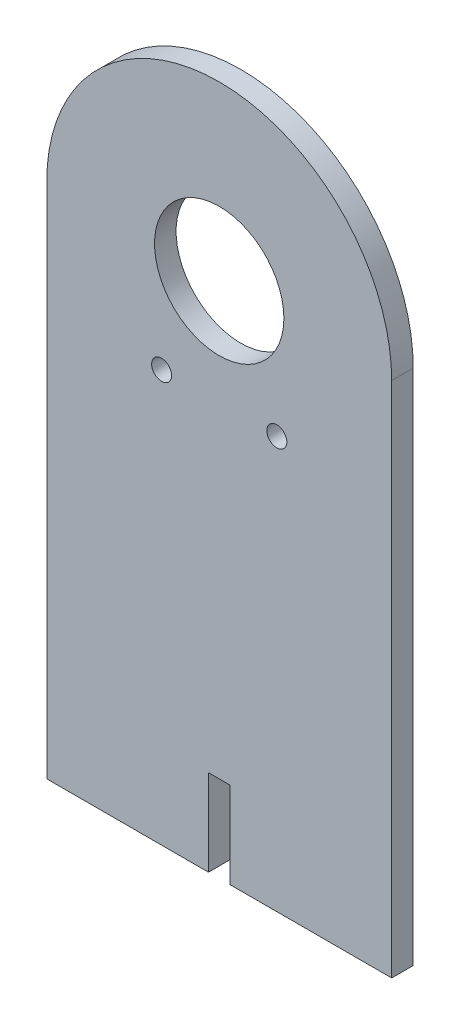
ISO-10303-21;
HEADER;
FILE_DESCRIPTION(('STEP AP214'),'2;1');
FILE_NAME('part.step','',(''),(''),'','','');
FILE_SCHEMA(('AUTOMOTIVE_DESIGN { 1 0 10303 214 1 1 1 1 }'));
ENDSEC;
DATA;
#1=APPLICATION_CONTEXT('core data for automotive mechanical design processes');
#2=APPLICATION_PROTOCOL_DEFINITION('international standard','automotive_design',2000,#1);
#3=PRODUCT_CONTEXT('',#1,'mechanical');
#4=PRODUCT('Part','Part','',(#3));
#5=PRODUCT_RELATED_PRODUCT_CATEGORY('part','',(#4));
#6=PRODUCT_DEFINITION_FORMATION('','',#4);
#7=PRODUCT_DEFINITION_CONTEXT('part definition',#1,'design');
#8=PRODUCT_DEFINITION('design','',#6,#7);
#9=PRODUCT_DEFINITION_SHAPE('','',#8);
#10=(LENGTH_UNIT() NAMED_UNIT(*) SI_UNIT(.MILLI.,.METRE.));
#11=(NAMED_UNIT(*) PLANE_ANGLE_UNIT() SI_UNIT($,.RADIAN.));
#12=(NAMED_UNIT(*) SI_UNIT($,.STERADIAN.) SOLID_ANGLE_UNIT());
#13=UNCERTAINTY_MEASURE_WITH_UNIT(LENGTH_MEASURE(1.E-05),#10,'distance_accuracy_value','');
#14=(GEOMETRIC_REPRESENTATION_CONTEXT(3) GLOBAL_UNCERTAINTY_ASSIGNED_CONTEXT((#13)) GLOBAL_UNIT_ASSIGNED_CONTEXT((#10,
#11,#12)) REPRESENTATION_CONTEXT('',''));
#15=CARTESIAN_POINT('',(0.,0.,0.));
#16=DIRECTION('',(0.,0.,1.));
#17=DIRECTION('',(1.,0.,0.));
#18=AXIS2_PLACEMENT_3D('',#15,#16,#17);
#19=CARTESIAN_POINT('',(0.,0.,3.175));
#20=DIRECTION('',(0.,1.,0.));
#21=DIRECTION('',(0.,0.,1.));
#22=AXIS2_PLACEMENT_3D('',#19,#20,#21);
#23=PLANE('',#22);
#24=DIRECTION('',(1.,0.,0.));
#25=VECTOR('',#24,1.);
#26=CARTESIAN_POINT('',(0.,0.,0.));
#27=LINE('',#26,#25);
#28=CARTESIAN_POINT('',(0.,0.,0.));
#29=VERTEX_POINT('',#28);
#30=CARTESIAN_POINT('',(23.8125,0.,0.));
#31=VERTEX_POINT('',#30);
#32=EDGE_CURVE('E127',#29,#31,#27,.T.);
#33=ORIENTED_EDGE('',*,*,#32,.T.);
#34=DIRECTION('',(0.,0.,1.));
#35=VECTOR('',#34,1.);
#36=CARTESIAN_POINT('',(23.8125,0.,-3.175));
#37=LINE('',#36,#35);
#38=CARTESIAN_POINT('',(23.8125,0.,3.175));
#39=VERTEX_POINT('',#38);
#40=EDGE_CURVE('E117',#31,#39,#37,.T.);
#41=ORIENTED_EDGE('',*,*,#40,.T.);
#42=DIRECTION('',(1.,0.,0.));
#43=VECTOR('',#42,1.);
#44=CARTESIAN_POINT('',(0.,0.,3.175));
#45=LINE('',#44,#43);
#46=CARTESIAN_POINT('',(0.,0.,3.175));
#47=VERTEX_POINT('',#46);
#48=EDGE_CURVE('E93',#47,#39,#45,.T.);
#49=ORIENTED_EDGE('',*,*,#48,.F.);
#50=DIRECTION('',(0.,0.,-1.));
#51=VECTOR('',#50,1.);
#52=CARTESIAN_POINT('',(0.,0.,3.175));
#53=LINE('',#52,#51);
#54=EDGE_CURVE('E169',#47,#29,#53,.T.);
#55=ORIENTED_EDGE('',*,*,#54,.T.);
#56=EDGE_LOOP('',(#33,#41,#49,#55));
#57=FACE_BOUND('',#56,.T.);
#58=ADVANCED_FACE('F39',(#57),#23,.F.);
#59=CARTESIAN_POINT('',(0.,0.,3.175));
#60=DIRECTION('',(1.,0.,0.));
#61=DIRECTION('',(0.,0.,-1.));
#62=AXIS2_PLACEMENT_3D('',#59,#60,#61);
#63=PLANE('',#62);
#64=DIRECTION('',(0.,-1.,0.));
#65=VECTOR('',#64,1.);
#66=CARTESIAN_POINT('',(0.,0.,0.));
#67=LINE('',#66,#65);
#68=CARTESIAN_POINT('',(0.,76.2,0.));
#69=VERTEX_POINT('',#68);
#70=EDGE_CURVE('E148',#69,#29,#67,.T.);
#71=ORIENTED_EDGE('',*,*,#70,.T.);
#72=ORIENTED_EDGE('',*,*,#54,.F.);
#73=DIRECTION('',(0.,-1.,0.));
#74=VECTOR('',#73,1.);
#75=CARTESIAN_POINT('',(0.,0.,3.175));
#76=LINE('',#75,#74);
#77=CARTESIAN_POINT('',(0.,76.2,3.175));
#78=VERTEX_POINT('',#77);
#79=EDGE_CURVE('E134',#78,#47,#76,.T.);
#80=ORIENTED_EDGE('',*,*,#79,.F.);
#81=DIRECTION('',(0.,0.,-1.));
#82=VECTOR('',#81,1.);
#83=CARTESIAN_POINT('',(0.,76.2,3.175));
#84=LINE('',#83,#82);
#85=EDGE_CURVE('E147',#78,#69,#84,.T.);
#86=ORIENTED_EDGE('',*,*,#85,.T.);
#87=EDGE_LOOP('',(#71,#72,#80,#86));
#88=FACE_BOUND('',#87,.T.);
#89=ADVANCED_FACE('F41',(#88),#63,.F.);
#90=CARTESIAN_POINT('',(26.9875,0.,3.175));
#91=VERTEX_POINT('',#90);
#92=CARTESIAN_POINT('',(50.8,0.,3.175));
#93=VERTEX_POINT('',#92);
#94=EDGE_CURVE('E138',#91,#93,#45,.T.);
#95=ORIENTED_EDGE('',*,*,#94,.F.);
#96=DIRECTION('',(0.,0.,1.));
#97=VECTOR('',#96,1.);
#98=CARTESIAN_POINT('',(26.9875,0.,-3.175));
#99=LINE('',#98,#97);
#100=CARTESIAN_POINT('',(26.9875,0.,0.));
#101=VERTEX_POINT('',#100);
#102=EDGE_CURVE('E129',#101,#91,#99,.T.);
#103=ORIENTED_EDGE('',*,*,#102,.F.);
#104=CARTESIAN_POINT('',(50.8,0.,0.));
#105=VERTEX_POINT('',#104);
#106=EDGE_CURVE('E152',#101,#105,#27,.T.);
#107=ORIENTED_EDGE('',*,*,#106,.T.);
#108=DIRECTION('',(0.,0.,-1.));
#109=VECTOR('',#108,1.);
#110=CARTESIAN_POINT('',(50.8,0.,3.175));
#111=LINE('',#110,#109);
#112=EDGE_CURVE('E165',#93,#105,#111,.T.);
#113=ORIENTED_EDGE('',*,*,#112,.F.);
#114=EDGE_LOOP('',(#95,#103,#107,#113));
#115=FACE_BOUND('',#114,.T.);
#116=ADVANCED_FACE('F197',(#115),#23,.F.);
#117=CARTESIAN_POINT('',(50.8,0.,3.175));
#118=DIRECTION('',(-1.,0.,0.));
#119=DIRECTION('',(0.,0.,1.));
#120=AXIS2_PLACEMENT_3D('',#117,#118,#119);
#121=PLANE('',#120);
#122=DIRECTION('',(0.,1.,0.));
#123=VECTOR('',#122,1.);
#124=CARTESIAN_POINT('',(50.8,0.,0.));
#125=LINE('',#124,#123);
#126=CARTESIAN_POINT('',(50.8,76.2,0.));
#127=VERTEX_POINT('',#126);
#128=EDGE_CURVE('E155',#105,#127,#125,.T.);
#129=ORIENTED_EDGE('',*,*,#128,.T.);
#130=DIRECTION('',(0.,0.,-1.));
#131=VECTOR('',#130,1.);
#132=CARTESIAN_POINT('',(50.8,76.2,3.175));
#133=LINE('',#132,#131);
#134=CARTESIAN_POINT('',(50.8,76.2,3.175));
#135=VERTEX_POINT('',#134);
#136=EDGE_CURVE('E162',#135,#127,#133,.T.);
#137=ORIENTED_EDGE('',*,*,#136,.F.);
#138=DIRECTION('',(0.,1.,0.));
#139=VECTOR('',#138,1.);
#140=CARTESIAN_POINT('',(50.8,0.,3.175));
#141=LINE('',#140,#139);
#142=EDGE_CURVE('E137',#93,#135,#141,.T.);
#143=ORIENTED_EDGE('',*,*,#142,.F.);
#144=ORIENTED_EDGE('',*,*,#112,.T.);
#145=EDGE_LOOP('',(#129,#137,#143,#144));
#146=FACE_BOUND('',#145,.T.);
#147=ADVANCED_FACE('F202',(#146),#121,.F.);
#148=CARTESIAN_POINT('',(25.4,76.2,3.175));
#149=DIRECTION('',(0.,0.,-1.));
#150=DIRECTION('',(-1.,0.,0.));
#151=AXIS2_PLACEMENT_3D('',#148,#149,#150);
#152=CYLINDRICAL_SURFACE('',#151,25.4);
#153=CARTESIAN_POINT('',(25.4,76.2,0.));
#154=DIRECTION('',(0.,0.,1.));
#155=DIRECTION('',(1.,0.,0.));
#156=AXIS2_PLACEMENT_3D('',#153,#154,#155);
#157=CIRCLE('',#156,25.4);
#158=EDGE_CURVE('E85',#127,#69,#157,.T.);
#159=ORIENTED_EDGE('',*,*,#158,.T.);
#160=ORIENTED_EDGE('',*,*,#85,.F.);
#161=CARTESIAN_POINT('',(25.4,76.2,3.175));
#162=DIRECTION('',(0.,0.,1.));
#163=DIRECTION('',(1.,0.,0.));
#164=AXIS2_PLACEMENT_3D('',#161,#162,#163);
#165=CIRCLE('',#164,25.4);
#166=EDGE_CURVE('E64',#135,#78,#165,.T.);
#167=ORIENTED_EDGE('',*,*,#166,.F.);
#168=ORIENTED_EDGE('',*,*,#136,.T.);
#169=EDGE_LOOP('',(#159,#160,#167,#168));
#170=FACE_BOUND('',#169,.T.);
#171=ADVANCED_FACE('F203',(#170),#152,.T.);
#172=CARTESIAN_POINT('',(25.4,76.2,3.175));
#173=DIRECTION('',(0.,0.,1.));
#174=DIRECTION('',(1.,0.,0.));
#175=AXIS2_PLACEMENT_3D('',#172,#173,#174);
#176=PLANE('',#175);
#177=CARTESIAN_POINT('',(16.9164,60.6298,3.175));
#178=DIRECTION('',(0.,0.,1.));
#179=DIRECTION('',(1.,0.,0.));
#180=AXIS2_PLACEMENT_3D('',#177,#178,#179);
#181=CIRCLE('',#180,1.47319999999999);
#182=CARTESIAN_POINT('',(18.3896,60.6298,3.175));
#183=VERTEX_POINT('',#182);
#184=EDGE_CURVE('E251',#183,#183,#181,.T.);
#185=ORIENTED_EDGE('',*,*,#184,.F.);
#186=EDGE_LOOP('',(#185));
#187=FACE_BOUND('',#186,.T.);
#188=CARTESIAN_POINT('',(33.8836,60.6298,3.175));
#189=DIRECTION('',(0.,0.,1.));
#190=DIRECTION('',(1.,0.,0.));
#191=AXIS2_PLACEMENT_3D('',#188,#189,#190);
#192=CIRCLE('',#191,1.47319999999999);
#193=CARTESIAN_POINT('',(35.3568,60.6298,3.175));
#194=VERTEX_POINT('',#193);
#195=EDGE_CURVE('E255',#194,#194,#192,.T.);
#196=ORIENTED_EDGE('',*,*,#195,.F.);
#197=EDGE_LOOP('',(#196));
#198=FACE_BOUND('',#197,.T.);
#199=CARTESIAN_POINT('',(25.4,76.2,3.175));
#200=DIRECTION('',(0.,0.,1.));
#201=DIRECTION('',(1.,0.,0.));
#202=AXIS2_PLACEMENT_3D('',#199,#200,#201);
#203=CIRCLE('',#202,9.525);
#204=CARTESIAN_POINT('',(34.925,76.2,3.175));
#205=VERTEX_POINT('',#204);
#206=EDGE_CURVE('E265',#205,#205,#203,.T.);
#207=ORIENTED_EDGE('',*,*,#206,.F.);
#208=EDGE_LOOP('',(#207));
#209=FACE_BOUND('',#208,.T.);
#210=DIRECTION('',(0.,-1.,0.));
#211=VECTOR('',#210,1.);
#212=CARTESIAN_POINT('',(23.8125,0.,3.175));
#213=LINE('',#212,#211);
#214=CARTESIAN_POINT('',(23.8125,12.7,3.175));
#215=VERTEX_POINT('',#214);
#216=EDGE_CURVE('E115',#215,#39,#213,.T.);
#217=ORIENTED_EDGE('',*,*,#216,.F.);
#218=DIRECTION('',(-1.,0.,0.));
#219=VECTOR('',#218,1.);
#220=CARTESIAN_POINT('',(23.8125,12.7,3.175));
#221=LINE('',#220,#219);
#222=CARTESIAN_POINT('',(26.9875,12.7,3.175));
#223=VERTEX_POINT('',#222);
#224=EDGE_CURVE('E130',#223,#215,#221,.T.);
#225=ORIENTED_EDGE('',*,*,#224,.F.);
#226=DIRECTION('',(0.,1.,0.));
#227=VECTOR('',#226,1.);
#228=CARTESIAN_POINT('',(26.9875,0.,3.175));
#229=LINE('',#228,#227);
#230=EDGE_CURVE('E123',#91,#223,#229,.T.);
#231=ORIENTED_EDGE('',*,*,#230,.F.);
#232=ORIENTED_EDGE('',*,*,#94,.T.);
#233=ORIENTED_EDGE('',*,*,#142,.T.);
#234=ORIENTED_EDGE('',*,*,#166,.T.);
#235=ORIENTED_EDGE('',*,*,#79,.T.);
#236=ORIENTED_EDGE('',*,*,#48,.T.);
#237=EDGE_LOOP('',(#217,#225,#231,#232,#233,#234,#235,#236));
#238=FACE_BOUND('',#237,.T.);
#239=ADVANCED_FACE('F132',(#187,#198,#209,#238),#176,.T.);
#240=CARTESIAN_POINT('',(25.4,76.2,0.));
#241=DIRECTION('',(0.,0.,1.));
#242=DIRECTION('',(1.,0.,0.));
#243=AXIS2_PLACEMENT_3D('',#240,#241,#242);
#244=PLANE('',#243);
#245=CARTESIAN_POINT('',(16.9164,60.6298,0.));
#246=DIRECTION('',(0.,0.,1.));
#247=DIRECTION('',(1.,0.,0.));
#248=AXIS2_PLACEMENT_3D('',#245,#246,#247);
#249=CIRCLE('',#248,1.4732);
#250=CARTESIAN_POINT('',(18.3896,60.6298,0.));
#251=VERTEX_POINT('',#250);
#252=EDGE_CURVE('E248',#251,#251,#249,.T.);
#253=ORIENTED_EDGE('',*,*,#252,.T.);
#254=EDGE_LOOP('',(#253));
#255=FACE_BOUND('',#254,.T.);
#256=CARTESIAN_POINT('',(33.8836,60.6298,0.));
#257=DIRECTION('',(0.,0.,1.));
#258=DIRECTION('',(1.,0.,0.));
#259=AXIS2_PLACEMENT_3D('',#256,#257,#258);
#260=CIRCLE('',#259,1.4732);
#261=CARTESIAN_POINT('',(35.3568,60.6298,0.));
#262=VERTEX_POINT('',#261);
#263=EDGE_CURVE('E261',#262,#262,#260,.T.);
#264=ORIENTED_EDGE('',*,*,#263,.T.);
#265=EDGE_LOOP('',(#264));
#266=FACE_BOUND('',#265,.T.);
#267=CARTESIAN_POINT('',(25.4,76.2,0.));
#268=DIRECTION('',(0.,0.,1.));
#269=DIRECTION('',(1.,0.,0.));
#270=AXIS2_PLACEMENT_3D('',#267,#268,#269);
#271=CIRCLE('',#270,9.525);
#272=CARTESIAN_POINT('',(34.925,76.2,0.));
#273=VERTEX_POINT('',#272);
#274=EDGE_CURVE('E124',#273,#273,#271,.T.);
#275=ORIENTED_EDGE('',*,*,#274,.T.);
#276=EDGE_LOOP('',(#275));
#277=FACE_BOUND('',#276,.T.);
#278=DIRECTION('',(-1.,0.,0.));
#279=VECTOR('',#278,1.);
#280=CARTESIAN_POINT('',(25.4,12.7,0.));
#281=LINE('',#280,#279);
#282=CARTESIAN_POINT('',(26.9875,12.7,0.));
#283=VERTEX_POINT('',#282);
#284=CARTESIAN_POINT('',(23.8125,12.7,0.));
#285=VERTEX_POINT('',#284);
#286=EDGE_CURVE('E48',#283,#285,#281,.T.);
#287=ORIENTED_EDGE('',*,*,#286,.T.);
#288=DIRECTION('',(0.,-1.,0.));
#289=VECTOR('',#288,1.);
#290=CARTESIAN_POINT('',(23.8125,76.2,0.));
#291=LINE('',#290,#289);
#292=EDGE_CURVE('E11',#285,#31,#291,.T.);
#293=ORIENTED_EDGE('',*,*,#292,.T.);
#294=ORIENTED_EDGE('',*,*,#32,.F.);
#295=ORIENTED_EDGE('',*,*,#70,.F.);
#296=ORIENTED_EDGE('',*,*,#158,.F.);
#297=ORIENTED_EDGE('',*,*,#128,.F.);
#298=ORIENTED_EDGE('',*,*,#106,.F.);
#299=DIRECTION('',(0.,1.,0.));
#300=VECTOR('',#299,1.);
#301=CARTESIAN_POINT('',(26.9875,76.2,0.));
#302=LINE('',#301,#300);
#303=EDGE_CURVE('E172',#101,#283,#302,.T.);
#304=ORIENTED_EDGE('',*,*,#303,.T.);
#305=EDGE_LOOP('',(#287,#293,#294,#295,#296,#297,#298,#304));
#306=FACE_BOUND('',#305,.T.);
#307=ADVANCED_FACE('F178',(#255,#266,#277,#306),#244,.F.);
#308=CARTESIAN_POINT('',(23.8125,0.,-3.175));
#309=DIRECTION('',(-1.,0.,0.));
#310=DIRECTION('',(0.,0.,1.));
#311=AXIS2_PLACEMENT_3D('',#308,#309,#310);
#312=PLANE('',#311);
#313=DIRECTION('',(0.,0.,1.));
#314=VECTOR('',#313,1.);
#315=CARTESIAN_POINT('',(23.8125,12.7,-3.175));
#316=LINE('',#315,#314);
#317=EDGE_CURVE('E119',#285,#215,#316,.T.);
#318=ORIENTED_EDGE('',*,*,#317,.T.);
#319=ORIENTED_EDGE('',*,*,#216,.T.);
#320=ORIENTED_EDGE('',*,*,#40,.F.);
#321=ORIENTED_EDGE('',*,*,#292,.F.);
#322=EDGE_LOOP('',(#318,#319,#320,#321));
#323=FACE_BOUND('',#322,.T.);
#324=ADVANCED_FACE('F116',(#323),#312,.F.);
#325=CARTESIAN_POINT('',(23.8125,12.7,-3.175));
#326=DIRECTION('',(0.,1.,0.));
#327=DIRECTION('',(0.,0.,1.));
#328=AXIS2_PLACEMENT_3D('',#325,#326,#327);
#329=PLANE('',#328);
#330=DIRECTION('',(0.,0.,1.));
#331=VECTOR('',#330,1.);
#332=CARTESIAN_POINT('',(26.9875,12.7,-3.175));
#333=LINE('',#332,#331);
#334=EDGE_CURVE('E55',#283,#223,#333,.T.);
#335=ORIENTED_EDGE('',*,*,#334,.T.);
#336=ORIENTED_EDGE('',*,*,#224,.T.);
#337=ORIENTED_EDGE('',*,*,#317,.F.);
#338=ORIENTED_EDGE('',*,*,#286,.F.);
#339=EDGE_LOOP('',(#335,#336,#337,#338));
#340=FACE_BOUND('',#339,.T.);
#341=ADVANCED_FACE('F181',(#340),#329,.F.);
#342=CARTESIAN_POINT('',(26.9875,0.,-3.175));
#343=DIRECTION('',(1.,0.,0.));
#344=DIRECTION('',(0.,1.,0.));
#345=AXIS2_PLACEMENT_3D('',#342,#343,#344);
#346=PLANE('',#345);
#347=ORIENTED_EDGE('',*,*,#102,.T.);
#348=ORIENTED_EDGE('',*,*,#230,.T.);
#349=ORIENTED_EDGE('',*,*,#334,.F.);
#350=ORIENTED_EDGE('',*,*,#303,.F.);
#351=EDGE_LOOP('',(#347,#348,#349,#350));
#352=FACE_BOUND('',#351,.T.);
#353=ADVANCED_FACE('F192',(#352),#346,.F.);
#354=CARTESIAN_POINT('',(25.4,76.2,3.175));
#355=DIRECTION('',(0.,0.,1.));
#356=DIRECTION('',(1.,0.,0.));
#357=AXIS2_PLACEMENT_3D('',#354,#355,#356);
#358=CYLINDRICAL_SURFACE('',#357,9.525);
#359=ORIENTED_EDGE('',*,*,#274,.F.);
#360=EDGE_LOOP('',(#359));
#361=FACE_BOUND('',#360,.T.);
#362=ORIENTED_EDGE('',*,*,#206,.T.);
#363=EDGE_LOOP('',(#362));
#364=FACE_BOUND('',#363,.T.);
#365=ADVANCED_FACE('F230',(#361,#364),#358,.F.);
#366=CARTESIAN_POINT('',(33.8836,60.6298,3.175));
#367=DIRECTION('',(0.,0.,1.));
#368=DIRECTION('',(1.,0.,0.));
#369=AXIS2_PLACEMENT_3D('',#366,#367,#368);
#370=CYLINDRICAL_SURFACE('',#369,1.4732);
#371=ORIENTED_EDGE('',*,*,#263,.F.);
#372=EDGE_LOOP('',(#371));
#373=FACE_BOUND('',#372,.T.);
#374=ORIENTED_EDGE('',*,*,#195,.T.);
#375=EDGE_LOOP('',(#374));
#376=FACE_BOUND('',#375,.T.);
#377=ADVANCED_FACE('F235',(#373,#376),#370,.F.);
#378=CARTESIAN_POINT('',(16.9164,60.6298,3.175));
#379=DIRECTION('',(0.,0.,1.));
#380=DIRECTION('',(1.,0.,0.));
#381=AXIS2_PLACEMENT_3D('',#378,#379,#380);
#382=CYLINDRICAL_SURFACE('',#381,1.4732);
#383=ORIENTED_EDGE('',*,*,#252,.F.);
#384=EDGE_LOOP('',(#383));
#385=FACE_BOUND('',#384,.T.);
#386=ORIENTED_EDGE('',*,*,#184,.T.);
#387=EDGE_LOOP('',(#386));
#388=FACE_BOUND('',#387,.T.);
#389=ADVANCED_FACE('F239',(#385,#388),#382,.F.);
#390=CLOSED_SHELL('',(#58,#89,#116,#147,#171,#239,#307,#324,#341,#353,#365,#377,#389));
#391=MANIFOLD_SOLID_BREP('B2',#390);
#392=ADVANCED_BREP_SHAPE_REPRESENTATION('',(#18,#391),#14);
#393=SHAPE_DEFINITION_REPRESENTATION(#9,#392);
ENDSEC;
END-ISO-10303-21;
